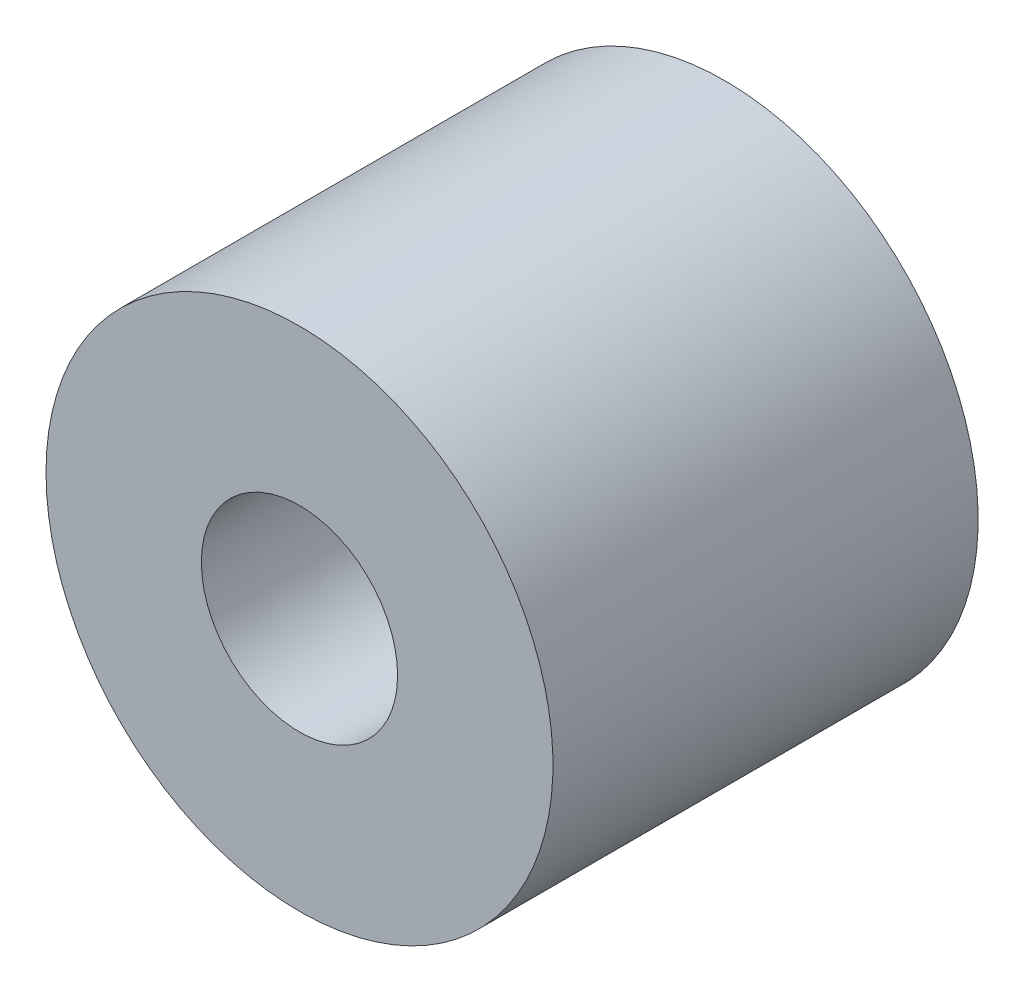
ISO-10303-21;
HEADER;
FILE_DESCRIPTION(('STEP AP214'),'2;1');
FILE_NAME('part.step','',(''),(''),'','','');
FILE_SCHEMA(('AUTOMOTIVE_DESIGN { 1 0 10303 214 1 1 1 1 }'));
ENDSEC;
DATA;
#1=APPLICATION_CONTEXT('core data for automotive mechanical design processes');
#2=APPLICATION_PROTOCOL_DEFINITION('international standard','automotive_design',2000,#1);
#3=PRODUCT_CONTEXT('',#1,'mechanical');
#4=PRODUCT('Part','Part','',(#3));
#5=PRODUCT_RELATED_PRODUCT_CATEGORY('part','',(#4));
#6=PRODUCT_DEFINITION_FORMATION('','',#4);
#7=PRODUCT_DEFINITION_CONTEXT('part definition',#1,'design');
#8=PRODUCT_DEFINITION('design','',#6,#7);
#9=PRODUCT_DEFINITION_SHAPE('','',#8);
#10=(LENGTH_UNIT() NAMED_UNIT(*) SI_UNIT(.MILLI.,.METRE.));
#11=(NAMED_UNIT(*) PLANE_ANGLE_UNIT() SI_UNIT($,.RADIAN.));
#12=(NAMED_UNIT(*) SI_UNIT($,.STERADIAN.) SOLID_ANGLE_UNIT());
#13=UNCERTAINTY_MEASURE_WITH_UNIT(LENGTH_MEASURE(1.E-05),#10,'distance_accuracy_value','');
#14=(GEOMETRIC_REPRESENTATION_CONTEXT(3) GLOBAL_UNCERTAINTY_ASSIGNED_CONTEXT((#13)) GLOBAL_UNIT_ASSIGNED_CONTEXT((#10,
#11,#12)) REPRESENTATION_CONTEXT('',''));
#15=CARTESIAN_POINT('',(0.,0.,0.));
#16=DIRECTION('',(0.,0.,1.));
#17=DIRECTION('',(1.,0.,0.));
#18=AXIS2_PLACEMENT_3D('',#15,#16,#17);
#19=CARTESIAN_POINT('',(0.,0.,13.));
#20=DIRECTION('',(0.,0.,1.));
#21=DIRECTION('',(1.,0.,0.));
#22=AXIS2_PLACEMENT_3D('',#19,#20,#21);
#23=PLANE('',#22);
#24=CARTESIAN_POINT('',(0.,0.,13.));
#25=DIRECTION('',(0.,0.,1.));
#26=DIRECTION('',(1.,0.,0.));
#27=AXIS2_PLACEMENT_3D('',#24,#25,#26);
#28=CIRCLE('',#27,7.75);
#29=CARTESIAN_POINT('',(-7.75,0.,13.));
#30=VERTEX_POINT('',#29);
#31=EDGE_CURVE('E10',#30,#30,#28,.T.);
#32=ORIENTED_EDGE('',*,*,#31,.T.);
#33=EDGE_LOOP('',(#32));
#34=FACE_BOUND('',#33,.T.);
#35=CARTESIAN_POINT('',(0.,0.,13.));
#36=DIRECTION('',(0.,0.,1.));
#37=DIRECTION('',(1.,0.,0.));
#38=AXIS2_PLACEMENT_3D('',#35,#36,#37);
#39=CIRCLE('',#38,3.);
#40=CARTESIAN_POINT('',(-3.,0.,13.));
#41=VERTEX_POINT('',#40);
#42=EDGE_CURVE('E51',#41,#41,#39,.T.);
#43=ORIENTED_EDGE('',*,*,#42,.F.);
#44=EDGE_LOOP('',(#43));
#45=FACE_BOUND('',#44,.T.);
#46=ADVANCED_FACE('F37',(#34,#45),#23,.T.);
#47=CARTESIAN_POINT('',(0.,0.,0.));
#48=DIRECTION('',(0.,0.,1.));
#49=DIRECTION('',(1.,0.,0.));
#50=AXIS2_PLACEMENT_3D('',#47,#48,#49);
#51=PLANE('',#50);
#52=CARTESIAN_POINT('',(0.,0.,0.));
#53=DIRECTION('',(0.,0.,1.));
#54=DIRECTION('',(1.,0.,0.));
#55=AXIS2_PLACEMENT_3D('',#52,#53,#54);
#56=CIRCLE('',#55,7.75);
#57=CARTESIAN_POINT('',(-7.75,0.,0.));
#58=VERTEX_POINT('',#57);
#59=EDGE_CURVE('E41',#58,#58,#56,.T.);
#60=ORIENTED_EDGE('',*,*,#59,.F.);
#61=EDGE_LOOP('',(#60));
#62=FACE_BOUND('',#61,.T.);
#63=CARTESIAN_POINT('',(0.,0.,0.));
#64=DIRECTION('',(0.,0.,1.));
#65=DIRECTION('',(1.,0.,0.));
#66=AXIS2_PLACEMENT_3D('',#63,#64,#65);
#67=CIRCLE('',#66,3.);
#68=CARTESIAN_POINT('',(-3.,0.,0.));
#69=VERTEX_POINT('',#68);
#70=EDGE_CURVE('E53',#69,#69,#67,.T.);
#71=ORIENTED_EDGE('',*,*,#70,.T.);
#72=EDGE_LOOP('',(#71));
#73=FACE_BOUND('',#72,.T.);
#74=ADVANCED_FACE('F63',(#62,#73),#51,.F.);
#75=CARTESIAN_POINT('',(0.,0.,13.));
#76=DIRECTION('',(0.,0.,-1.));
#77=DIRECTION('',(-1.,0.,0.));
#78=AXIS2_PLACEMENT_3D('',#75,#76,#77);
#79=CYLINDRICAL_SURFACE('',#78,7.75);
#80=CARTESIAN_POINT('',(-7.75,0.,13.));
#81=CARTESIAN_POINT('',(-7.75,0.,12.8645833333333));
#82=CARTESIAN_POINT('',(-7.75,0.,12.7291666666667));
#83=CARTESIAN_POINT('',(-7.75,0.,12.4583333333333));
#84=CARTESIAN_POINT('',(-7.75,0.,12.3229166666667));
#85=CARTESIAN_POINT('',(-7.75,0.,12.0520833333333));
#86=CARTESIAN_POINT('',(-7.75,0.,11.9166666666667));
#87=CARTESIAN_POINT('',(-7.75,0.,11.6458333333333));
#88=CARTESIAN_POINT('',(-7.75,0.,11.5104166666667));
#89=CARTESIAN_POINT('',(-7.75,0.,11.2395833333333));
#90=CARTESIAN_POINT('',(-7.75,0.,11.1041666666667));
#91=CARTESIAN_POINT('',(-7.75,0.,10.8333333333333));
#92=CARTESIAN_POINT('',(-7.75,0.,10.6979166666667));
#93=CARTESIAN_POINT('',(-7.75,0.,10.4270833333333));
#94=CARTESIAN_POINT('',(-7.75,0.,10.2916666666667));
#95=CARTESIAN_POINT('',(-7.75,0.,10.0208333333333));
#96=CARTESIAN_POINT('',(-7.75,0.,9.88541666666667));
#97=CARTESIAN_POINT('',(-7.75,0.,9.61458333333333));
#98=CARTESIAN_POINT('',(-7.75,0.,9.47916666666667));
#99=CARTESIAN_POINT('',(-7.75,0.,9.20833333333333));
#100=CARTESIAN_POINT('',(-7.75,0.,9.07291666666667));
#101=CARTESIAN_POINT('',(-7.75,0.,8.80208333333333));
#102=CARTESIAN_POINT('',(-7.75,0.,8.66666666666667));
#103=CARTESIAN_POINT('',(-7.75,0.,8.39583333333333));
#104=CARTESIAN_POINT('',(-7.75,0.,8.26041666666667));
#105=CARTESIAN_POINT('',(-7.75,0.,7.98958333333333));
#106=CARTESIAN_POINT('',(-7.75,0.,7.85416666666667));
#107=CARTESIAN_POINT('',(-7.75,0.,7.58333333333333));
#108=CARTESIAN_POINT('',(-7.75,0.,7.44791666666667));
#109=CARTESIAN_POINT('',(-7.75,0.,7.17708333333333));
#110=CARTESIAN_POINT('',(-7.75,0.,7.04166666666667));
#111=CARTESIAN_POINT('',(-7.75,0.,6.77083333333333));
#112=CARTESIAN_POINT('',(-7.75,0.,6.63541666666667));
#113=CARTESIAN_POINT('',(-7.75,0.,6.36458333333333));
#114=CARTESIAN_POINT('',(-7.75,0.,6.22916666666667));
#115=CARTESIAN_POINT('',(-7.75,0.,5.95833333333333));
#116=CARTESIAN_POINT('',(-7.75,0.,5.82291666666667));
#117=CARTESIAN_POINT('',(-7.75,0.,5.55208333333333));
#118=CARTESIAN_POINT('',(-7.75,0.,5.41666666666667));
#119=CARTESIAN_POINT('',(-7.75,0.,5.14583333333333));
#120=CARTESIAN_POINT('',(-7.75,0.,5.01041666666667));
#121=CARTESIAN_POINT('',(-7.75,0.,4.73958333333333));
#122=CARTESIAN_POINT('',(-7.75,0.,4.60416666666667));
#123=CARTESIAN_POINT('',(-7.75,0.,4.33333333333333));
#124=CARTESIAN_POINT('',(-7.75,0.,4.19791666666667));
#125=CARTESIAN_POINT('',(-7.75,0.,3.92708333333333));
#126=CARTESIAN_POINT('',(-7.75,0.,3.79166666666667));
#127=CARTESIAN_POINT('',(-7.75,0.,3.52083333333333));
#128=CARTESIAN_POINT('',(-7.75,0.,3.38541666666667));
#129=CARTESIAN_POINT('',(-7.75,0.,3.11458333333333));
#130=CARTESIAN_POINT('',(-7.75,0.,2.97916666666667));
#131=CARTESIAN_POINT('',(-7.75,0.,2.70833333333333));
#132=CARTESIAN_POINT('',(-7.75,0.,2.57291666666667));
#133=CARTESIAN_POINT('',(-7.75,0.,2.30208333333333));
#134=CARTESIAN_POINT('',(-7.75,0.,2.16666666666667));
#135=CARTESIAN_POINT('',(-7.75,0.,1.89583333333333));
#136=CARTESIAN_POINT('',(-7.75,0.,1.76041666666667));
#137=CARTESIAN_POINT('',(-7.75,0.,1.48958333333333));
#138=CARTESIAN_POINT('',(-7.75,0.,1.35416666666667));
#139=CARTESIAN_POINT('',(-7.75,0.,1.08333333333333));
#140=CARTESIAN_POINT('',(-7.75,0.,0.947916666666667));
#141=CARTESIAN_POINT('',(-7.75,0.,0.677083333333334));
#142=CARTESIAN_POINT('',(-7.75,0.,0.541666666666667));
#143=CARTESIAN_POINT('',(-7.75,0.,0.270833333333334));
#144=CARTESIAN_POINT('',(-7.75,0.,0.135416666666667));
#145=CARTESIAN_POINT('',(-7.75,0.,0.));
#146=B_SPLINE_CURVE_WITH_KNOTS('',3,(#80,#81,#82,#83,#84,#85,#86,#87,#88,#89,#90,#91,#92,#93,
#94,#95,#96,#97,#98,#99,#100,#101,#102,#103,#104,#105,#106,#107,#108,#109,#110,#111,#112,#113,
#114,#115,#116,#117,#118,#119,#120,#121,#122,#123,#124,#125,#126,#127,#128,#129,#130,#131,#132,
#133,#134,#135,#136,#137,#138,#139,#140,#141,#142,#143,#144,#145),.UNSPECIFIED.,.F.,.F.,(4,2,2,
2,2,2,2,2,2,2,2,2,2,2,2,2,2,2,2,2,2,2,2,2,2,2,2,2,2,2,2,2,4),(0.,0.406249999999999,
0.812499999999999,1.21875,1.625,2.03125,2.4375,2.84375,3.25,3.65625,4.0625,4.46875,4.875,
5.28125,5.6875,6.09375,6.5,6.90625,7.3125,7.71875,8.125,8.53125,8.9375,9.34375,9.75,10.15625,
10.5625,10.96875,11.375,11.78125,12.1875,12.59375,13.),.UNSPECIFIED.);
#147=EDGE_CURVE('BSEAM39',#30,#58,#146,.T.);
#148=ORIENTED_EDGE('',*,*,#31,.F.);
#149=ORIENTED_EDGE('',*,*,#59,.T.);
#150=ORIENTED_EDGE('',*,*,#147,.T.);
#151=ORIENTED_EDGE('',*,*,#147,.F.);
#152=EDGE_LOOP('',(#148,#150,#149,#151));
#153=FACE_BOUND('',#152,.T.);
#154=ADVANCED_FACE('F39',(#153),#79,.T.);
#155=CARTESIAN_POINT('',(0.,0.,13.));
#156=DIRECTION('',(0.,0.,-1.));
#157=DIRECTION('',(-1.,0.,0.));
#158=AXIS2_PLACEMENT_3D('',#155,#156,#157);
#159=CYLINDRICAL_SURFACE('',#158,3.);
#160=CARTESIAN_POINT('',(-3.,0.,13.));
#161=CARTESIAN_POINT('',(-3.,0.,12.8645833333333));
#162=CARTESIAN_POINT('',(-3.,0.,12.7291666666667));
#163=CARTESIAN_POINT('',(-3.,0.,12.4583333333333));
#164=CARTESIAN_POINT('',(-3.,0.,12.3229166666667));
#165=CARTESIAN_POINT('',(-3.,0.,12.0520833333333));
#166=CARTESIAN_POINT('',(-3.,0.,11.9166666666667));
#167=CARTESIAN_POINT('',(-3.,0.,11.6458333333333));
#168=CARTESIAN_POINT('',(-3.,0.,11.5104166666667));
#169=CARTESIAN_POINT('',(-3.,0.,11.2395833333333));
#170=CARTESIAN_POINT('',(-3.,0.,11.1041666666667));
#171=CARTESIAN_POINT('',(-3.,0.,10.8333333333333));
#172=CARTESIAN_POINT('',(-3.,0.,10.6979166666667));
#173=CARTESIAN_POINT('',(-3.,0.,10.4270833333333));
#174=CARTESIAN_POINT('',(-3.,0.,10.2916666666667));
#175=CARTESIAN_POINT('',(-3.,0.,10.0208333333333));
#176=CARTESIAN_POINT('',(-3.,0.,9.88541666666667));
#177=CARTESIAN_POINT('',(-3.,0.,9.61458333333333));
#178=CARTESIAN_POINT('',(-3.,0.,9.47916666666667));
#179=CARTESIAN_POINT('',(-3.,0.,9.20833333333333));
#180=CARTESIAN_POINT('',(-3.,0.,9.07291666666667));
#181=CARTESIAN_POINT('',(-3.,0.,8.80208333333333));
#182=CARTESIAN_POINT('',(-3.,0.,8.66666666666667));
#183=CARTESIAN_POINT('',(-3.,0.,8.39583333333333));
#184=CARTESIAN_POINT('',(-3.,0.,8.26041666666667));
#185=CARTESIAN_POINT('',(-3.,0.,7.98958333333333));
#186=CARTESIAN_POINT('',(-3.,0.,7.85416666666667));
#187=CARTESIAN_POINT('',(-3.,0.,7.58333333333333));
#188=CARTESIAN_POINT('',(-3.,0.,7.44791666666667));
#189=CARTESIAN_POINT('',(-3.,0.,7.17708333333333));
#190=CARTESIAN_POINT('',(-3.,0.,7.04166666666667));
#191=CARTESIAN_POINT('',(-3.,0.,6.77083333333333));
#192=CARTESIAN_POINT('',(-3.,0.,6.63541666666667));
#193=CARTESIAN_POINT('',(-3.,0.,6.36458333333333));
#194=CARTESIAN_POINT('',(-3.,0.,6.22916666666667));
#195=CARTESIAN_POINT('',(-3.,0.,5.95833333333333));
#196=CARTESIAN_POINT('',(-3.,0.,5.82291666666667));
#197=CARTESIAN_POINT('',(-3.,0.,5.55208333333333));
#198=CARTESIAN_POINT('',(-3.,0.,5.41666666666667));
#199=CARTESIAN_POINT('',(-3.,0.,5.14583333333333));
#200=CARTESIAN_POINT('',(-3.,0.,5.01041666666667));
#201=CARTESIAN_POINT('',(-3.,0.,4.73958333333333));
#202=CARTESIAN_POINT('',(-3.,0.,4.60416666666667));
#203=CARTESIAN_POINT('',(-3.,0.,4.33333333333333));
#204=CARTESIAN_POINT('',(-3.,0.,4.19791666666667));
#205=CARTESIAN_POINT('',(-3.,0.,3.92708333333333));
#206=CARTESIAN_POINT('',(-3.,0.,3.79166666666667));
#207=CARTESIAN_POINT('',(-3.,0.,3.52083333333333));
#208=CARTESIAN_POINT('',(-3.,0.,3.38541666666667));
#209=CARTESIAN_POINT('',(-3.,0.,3.11458333333333));
#210=CARTESIAN_POINT('',(-3.,0.,2.97916666666667));
#211=CARTESIAN_POINT('',(-3.,0.,2.70833333333333));
#212=CARTESIAN_POINT('',(-3.,0.,2.57291666666667));
#213=CARTESIAN_POINT('',(-3.,0.,2.30208333333333));
#214=CARTESIAN_POINT('',(-3.,0.,2.16666666666667));
#215=CARTESIAN_POINT('',(-3.,0.,1.89583333333333));
#216=CARTESIAN_POINT('',(-3.,0.,1.76041666666667));
#217=CARTESIAN_POINT('',(-3.,0.,1.48958333333333));
#218=CARTESIAN_POINT('',(-3.,0.,1.35416666666667));
#219=CARTESIAN_POINT('',(-3.,0.,1.08333333333333));
#220=CARTESIAN_POINT('',(-3.,0.,0.947916666666667));
#221=CARTESIAN_POINT('',(-3.,0.,0.677083333333334));
#222=CARTESIAN_POINT('',(-3.,0.,0.541666666666667));
#223=CARTESIAN_POINT('',(-3.,0.,0.270833333333334));
#224=CARTESIAN_POINT('',(-3.,0.,0.135416666666667));
#225=CARTESIAN_POINT('',(-3.,0.,0.));
#226=B_SPLINE_CURVE_WITH_KNOTS('',3,(#160,#161,#162,#163,#164,#165,#166,#167,#168,#169,#170,
#171,#172,#173,#174,#175,#176,#177,#178,#179,#180,#181,#182,#183,#184,#185,#186,#187,#188,#189,
#190,#191,#192,#193,#194,#195,#196,#197,#198,#199,#200,#201,#202,#203,#204,#205,#206,#207,#208,
#209,#210,#211,#212,#213,#214,#215,#216,#217,#218,#219,#220,#221,#222,#223,#224,#225),
.UNSPECIFIED.,.F.,.F.,(4,2,2,2,2,2,2,2,2,2,2,2,2,2,2,2,2,2,2,2,2,2,2,2,2,2,2,2,2,2,2,2,4),(0.,
0.406249999999999,0.812499999999999,1.21875,1.625,2.03125,2.4375,2.84375,3.25,3.65625,4.0625,
4.46875,4.875,5.28125,5.6875,6.09375,6.5,6.90625,7.3125,7.71875,8.125,8.53125,8.9375,9.34375,
9.75,10.15625,10.5625,10.96875,11.375,11.78125,12.1875,12.59375,13.),.UNSPECIFIED.);
#227=EDGE_CURVE('BSEAM59',#41,#69,#226,.T.);
#228=ORIENTED_EDGE('',*,*,#42,.T.);
#229=ORIENTED_EDGE('',*,*,#70,.F.);
#230=ORIENTED_EDGE('',*,*,#227,.T.);
#231=ORIENTED_EDGE('',*,*,#227,.F.);
#232=EDGE_LOOP('',(#228,#230,#229,#231));
#233=FACE_BOUND('',#232,.T.);
#234=ADVANCED_FACE('F59',(#233),#159,.F.);
#235=CLOSED_SHELL('',(#46,#74,#154,#234));
#236=MANIFOLD_SOLID_BREP('B2',#235);
#237=ADVANCED_BREP_SHAPE_REPRESENTATION('',(#18,#236),#14);
#238=SHAPE_DEFINITION_REPRESENTATION(#9,#237);
ENDSEC;
END-ISO-10303-21;
